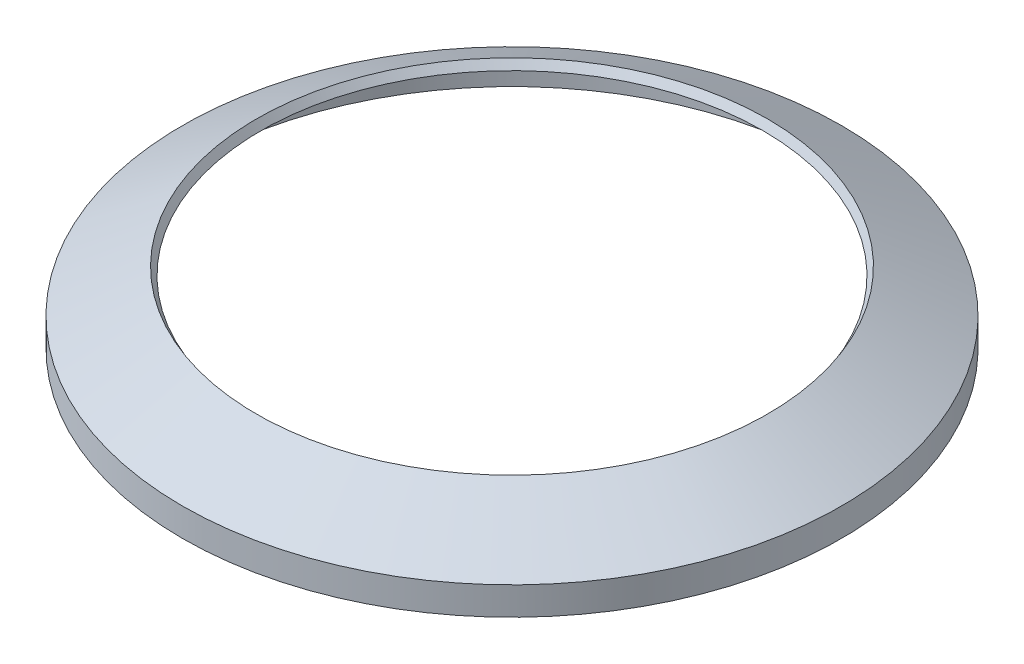
ISO-10303-21;
HEADER;
FILE_DESCRIPTION(('STEP AP214'),'2;1');
FILE_NAME('part.step','',(''),(''),'','','');
FILE_SCHEMA(('AUTOMOTIVE_DESIGN { 1 0 10303 214 1 1 1 1 }'));
ENDSEC;
DATA;
#1=APPLICATION_CONTEXT('core data for automotive mechanical design processes');
#2=APPLICATION_PROTOCOL_DEFINITION('international standard','automotive_design',2000,#1);
#3=PRODUCT_CONTEXT('',#1,'mechanical');
#4=PRODUCT('Part','Part','',(#3));
#5=PRODUCT_RELATED_PRODUCT_CATEGORY('part','',(#4));
#6=PRODUCT_DEFINITION_FORMATION('','',#4);
#7=PRODUCT_DEFINITION_CONTEXT('part definition',#1,'design');
#8=PRODUCT_DEFINITION('design','',#6,#7);
#9=PRODUCT_DEFINITION_SHAPE('','',#8);
#10=(LENGTH_UNIT() NAMED_UNIT(*) SI_UNIT(.MILLI.,.METRE.));
#11=(NAMED_UNIT(*) PLANE_ANGLE_UNIT() SI_UNIT($,.RADIAN.));
#12=(NAMED_UNIT(*) SI_UNIT($,.STERADIAN.) SOLID_ANGLE_UNIT());
#13=UNCERTAINTY_MEASURE_WITH_UNIT(LENGTH_MEASURE(1.E-05),#10,'distance_accuracy_value','');
#14=(GEOMETRIC_REPRESENTATION_CONTEXT(3) GLOBAL_UNCERTAINTY_ASSIGNED_CONTEXT((#13)) GLOBAL_UNIT_ASSIGNED_CONTEXT((#10,
#11,#12)) REPRESENTATION_CONTEXT('',''));
#15=CARTESIAN_POINT('',(0.,0.,0.));
#16=DIRECTION('',(0.,0.,1.));
#17=DIRECTION('',(1.,0.,0.));
#18=AXIS2_PLACEMENT_3D('',#15,#16,#17);
#19=CARTESIAN_POINT('',(0.,0.,0.));
#20=DIRECTION('',(0.,-1.,0.));
#21=DIRECTION('',(0.,0.,-1.));
#22=AXIS2_PLACEMENT_3D('',#19,#20,#21);
#23=CYLINDRICAL_SURFACE('',#22,45.847);
#24=CARTESIAN_POINT('',(0.,-3.175,0.));
#25=DIRECTION('',(0.,-1.,0.));
#26=DIRECTION('',(0.,0.,-1.));
#27=AXIS2_PLACEMENT_3D('',#24,#25,#26);
#28=CIRCLE('',#27,45.847);
#29=CARTESIAN_POINT('',(0.,-3.175,-45.847));
#30=VERTEX_POINT('',#29);
#31=EDGE_CURVE('E10',#30,#30,#28,.T.);
#32=ORIENTED_EDGE('',*,*,#31,.F.);
#33=EDGE_LOOP('',(#32));
#34=FACE_BOUND('',#33,.T.);
#35=CARTESIAN_POINT('',(0.,0.733234841870825,0.));
#36=DIRECTION('',(0.,-1.,0.));
#37=DIRECTION('',(0.,0.,-1.));
#38=AXIS2_PLACEMENT_3D('',#35,#36,#37);
#39=CIRCLE('',#38,45.847);
#40=CARTESIAN_POINT('',(0.,0.733234841870825,-45.847));
#41=VERTEX_POINT('',#40);
#42=EDGE_CURVE('E70',#41,#41,#39,.T.);
#43=ORIENTED_EDGE('',*,*,#42,.T.);
#44=EDGE_LOOP('',(#43));
#45=FACE_BOUND('',#44,.T.);
#46=ADVANCED_FACE('F43',(#34,#45),#23,.T.);
#47=CARTESIAN_POINT('',(-44.577,-3.175,0.));
#48=DIRECTION('',(0.,-1.,0.));
#49=DIRECTION('',(0.,0.,-1.));
#50=AXIS2_PLACEMENT_3D('',#47,#48,#49);
#51=PLANE('',#50);
#52=ORIENTED_EDGE('',*,*,#31,.T.);
#53=EDGE_LOOP('',(#52));
#54=FACE_BOUND('',#53,.T.);
#55=CARTESIAN_POINT('',(0.,-3.175,0.));
#56=DIRECTION('',(0.,-1.,0.));
#57=DIRECTION('',(0.,0.,-1.));
#58=AXIS2_PLACEMENT_3D('',#55,#56,#57);
#59=CIRCLE('',#58,44.577);
#60=CARTESIAN_POINT('',(0.,-3.175,-44.577));
#61=VERTEX_POINT('',#60);
#62=EDGE_CURVE('E50',#61,#61,#59,.T.);
#63=ORIENTED_EDGE('',*,*,#62,.F.);
#64=EDGE_LOOP('',(#63));
#65=FACE_BOUND('',#64,.T.);
#66=ADVANCED_FACE('F94',(#54,#65),#51,.T.);
#67=CARTESIAN_POINT('',(0.,0.,0.));
#68=DIRECTION('',(0.,-1.,0.));
#69=DIRECTION('',(0.,0.,-1.));
#70=AXIS2_PLACEMENT_3D('',#67,#68,#69);
#71=CYLINDRICAL_SURFACE('',#70,44.577);
#72=ORIENTED_EDGE('',*,*,#62,.T.);
#73=EDGE_LOOP('',(#72));
#74=FACE_BOUND('',#73,.T.);
#75=CARTESIAN_POINT('',(0.,0.,0.));
#76=DIRECTION('',(0.,-1.,0.));
#77=DIRECTION('',(0.,0.,-1.));
#78=AXIS2_PLACEMENT_3D('',#75,#76,#77);
#79=CIRCLE('',#78,44.577);
#80=CARTESIAN_POINT('',(0.,0.,-44.577));
#81=VERTEX_POINT('',#80);
#82=EDGE_CURVE('E55',#81,#81,#79,.T.);
#83=ORIENTED_EDGE('',*,*,#82,.F.);
#84=EDGE_LOOP('',(#83));
#85=FACE_BOUND('',#84,.T.);
#86=ADVANCED_FACE('F90',(#74,#85),#71,.F.);
#87=CARTESIAN_POINT('',(0.,5.57258479821829,0.));
#88=DIRECTION('',(0.,-1.,0.));
#89=DIRECTION('',(0.,0.,-1.));
#90=AXIS2_PLACEMENT_3D('',#87,#88,#89);
#91=CONICAL_SURFACE('',#90,34.925,1.0471975511966);
#92=ORIENTED_EDGE('',*,*,#82,.T.);
#93=EDGE_LOOP('',(#92));
#94=FACE_BOUND('',#93,.T.);
#95=CARTESIAN_POINT('',(0.,5.57258479821829,0.));
#96=DIRECTION('',(0.,-1.,0.));
#97=DIRECTION('',(0.,0.,-1.));
#98=AXIS2_PLACEMENT_3D('',#95,#96,#97);
#99=CIRCLE('',#98,34.925);
#100=CARTESIAN_POINT('',(0.,5.57258479821829,-34.925));
#101=VERTEX_POINT('',#100);
#102=EDGE_CURVE('E60',#101,#101,#99,.T.);
#103=ORIENTED_EDGE('',*,*,#102,.F.);
#104=EDGE_LOOP('',(#103));
#105=FACE_BOUND('',#104,.T.);
#106=ADVANCED_FACE('F84',(#94,#105),#91,.F.);
#107=CARTESIAN_POINT('',(0.,6.67243706102452,0.));
#108=DIRECTION('',(0.,1.,0.));
#109=DIRECTION('',(0.,0.,1.));
#110=AXIS2_PLACEMENT_3D('',#107,#108,#109);
#111=CONICAL_SURFACE('',#110,35.56,0.523598775598301);
#112=ORIENTED_EDGE('',*,*,#102,.T.);
#113=EDGE_LOOP('',(#112));
#114=FACE_BOUND('',#113,.T.);
#115=CARTESIAN_POINT('',(0.,6.67243706102452,0.));
#116=DIRECTION('',(0.,-1.,0.));
#117=DIRECTION('',(0.,0.,-1.));
#118=AXIS2_PLACEMENT_3D('',#115,#116,#117);
#119=CIRCLE('',#118,35.56);
#120=CARTESIAN_POINT('',(0.,6.67243706102452,-35.56));
#121=VERTEX_POINT('',#120);
#122=EDGE_CURVE('E66',#121,#121,#119,.T.);
#123=ORIENTED_EDGE('',*,*,#122,.F.);
#124=EDGE_LOOP('',(#123));
#125=FACE_BOUND('',#124,.T.);
#126=ADVANCED_FACE('F79',(#114,#125),#111,.F.);
#127=CARTESIAN_POINT('',(0.,6.67243706102452,0.));
#128=DIRECTION('',(0.,-1.,0.));
#129=DIRECTION('',(0.,0.,-1.));
#130=AXIS2_PLACEMENT_3D('',#127,#128,#129);
#131=CONICAL_SURFACE('',#130,35.56,1.0471975511966);
#132=ORIENTED_EDGE('',*,*,#42,.F.);
#133=EDGE_LOOP('',(#132));
#134=FACE_BOUND('',#133,.T.);
#135=ORIENTED_EDGE('',*,*,#122,.T.);
#136=EDGE_LOOP('',(#135));
#137=FACE_BOUND('',#136,.T.);
#138=ADVANCED_FACE('F76',(#134,#137),#131,.T.);
#139=CLOSED_SHELL('',(#46,#66,#86,#106,#126,#138));
#140=MANIFOLD_SOLID_BREP('B2',#139);
#141=ADVANCED_BREP_SHAPE_REPRESENTATION('',(#18,#140),#14);
#142=SHAPE_DEFINITION_REPRESENTATION(#9,#141);
ENDSEC;
END-ISO-10303-21;
